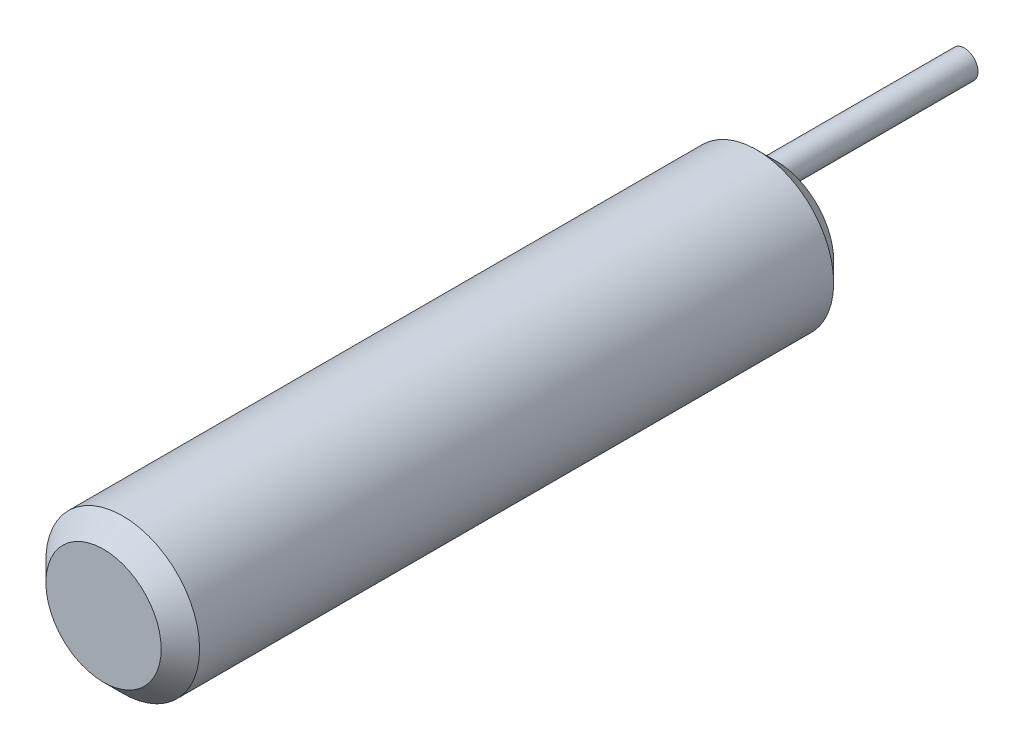
ISO-10303-21;
HEADER;
FILE_DESCRIPTION(('STEP AP214'),'2;1');
FILE_NAME('part.step','',(''),(''),'','','');
FILE_SCHEMA(('AUTOMOTIVE_DESIGN { 1 0 10303 214 1 1 1 1 }'));
ENDSEC;
DATA;
#1=APPLICATION_CONTEXT('core data for automotive mechanical design processes');
#2=APPLICATION_PROTOCOL_DEFINITION('international standard','automotive_design',2000,#1);
#3=PRODUCT_CONTEXT('',#1,'mechanical');
#4=PRODUCT('Part','Part','',(#3));
#5=PRODUCT_RELATED_PRODUCT_CATEGORY('part','',(#4));
#6=PRODUCT_DEFINITION_FORMATION('','',#4);
#7=PRODUCT_DEFINITION_CONTEXT('part definition',#1,'design');
#8=PRODUCT_DEFINITION('design','',#6,#7);
#9=PRODUCT_DEFINITION_SHAPE('','',#8);
#10=(LENGTH_UNIT() NAMED_UNIT(*) SI_UNIT(.MILLI.,.METRE.));
#11=(NAMED_UNIT(*) PLANE_ANGLE_UNIT() SI_UNIT($,.RADIAN.));
#12=(NAMED_UNIT(*) SI_UNIT($,.STERADIAN.) SOLID_ANGLE_UNIT());
#13=UNCERTAINTY_MEASURE_WITH_UNIT(LENGTH_MEASURE(1.E-05),#10,'distance_accuracy_value','');
#14=(GEOMETRIC_REPRESENTATION_CONTEXT(3) GLOBAL_UNCERTAINTY_ASSIGNED_CONTEXT((#13)) GLOBAL_UNIT_ASSIGNED_CONTEXT((#10,
#11,#12)) REPRESENTATION_CONTEXT('',''));
#15=CARTESIAN_POINT('',(0.,0.,0.));
#16=DIRECTION('',(0.,0.,1.));
#17=DIRECTION('',(1.,0.,0.));
#18=AXIS2_PLACEMENT_3D('',#15,#16,#17);
#19=CARTESIAN_POINT('',(0.,0.,0.));
#20=DIRECTION('',(0.,0.,1.));
#21=DIRECTION('',(1.,0.,0.));
#22=AXIS2_PLACEMENT_3D('',#19,#20,#21);
#23=PLANE('',#22);
#24=CARTESIAN_POINT('',(0.,0.,0.));
#25=DIRECTION('',(0.,0.,1.));
#26=DIRECTION('',(1.,0.,0.));
#27=AXIS2_PLACEMENT_3D('',#24,#25,#26);
#28=CIRCLE('',#27,3.);
#29=CARTESIAN_POINT('',(-0.262676540287967,2.98847804662881,0.));
#30=VERTEX_POINT('',#29);
#31=EDGE_CURVE('E41',#30,#30,#28,.F.);
#32=ORIENTED_EDGE('',*,*,#31,.T.);
#33=CARTESIAN_POINT('',(-0.200233264504433,2.27805922264817,0.));
#34=DIRECTION('',(0.,0.,-1.));
#35=DIRECTION('',(-1.,0.,0.));
#36=AXIS2_PLACEMENT_3D('',#33,#34,#35);
#37=CIRCLE('',#36,0.713157814341685);
#38=EDGE_CURVE('E57',#30,#30,#37,.T.);
#39=ORIENTED_EDGE('',*,*,#38,.F.);
#40=EDGE_LOOP('',(#32,#39));
#41=FACE_BOUND('',#40,.T.);
#42=ADVANCED_FACE('F34',(#41),#23,.F.);
#43=CARTESIAN_POINT('',(0.,0.,35.));
#44=DIRECTION('',(0.,0.,-1.));
#45=DIRECTION('',(-1.,0.,0.));
#46=AXIS2_PLACEMENT_3D('',#43,#44,#45);
#47=CYLINDRICAL_SURFACE('',#46,4.);
#48=CARTESIAN_POINT('',(0.,0.,1.));
#49=DIRECTION('',(0.,0.,1.));
#50=DIRECTION('',(1.,0.,0.));
#51=AXIS2_PLACEMENT_3D('',#48,#49,#50);
#52=CIRCLE('',#51,4.);
#53=CARTESIAN_POINT('',(4.,0.,1.));
#54=VERTEX_POINT('',#53);
#55=EDGE_CURVE('E49',#54,#54,#52,.T.);
#56=ORIENTED_EDGE('',*,*,#55,.T.);
#57=EDGE_LOOP('',(#56));
#58=FACE_BOUND('',#57,.T.);
#59=CARTESIAN_POINT('',(0.,0.,34.));
#60=DIRECTION('',(0.,0.,1.));
#61=DIRECTION('',(1.,0.,0.));
#62=AXIS2_PLACEMENT_3D('',#59,#60,#61);
#63=CIRCLE('',#62,4.);
#64=CARTESIAN_POINT('',(4.,0.,34.));
#65=VERTEX_POINT('',#64);
#66=EDGE_CURVE('E51',#65,#65,#63,.F.);
#67=ORIENTED_EDGE('',*,*,#66,.T.);
#68=EDGE_LOOP('',(#67));
#69=FACE_BOUND('',#68,.T.);
#70=ADVANCED_FACE('F70',(#58,#69),#47,.T.);
#71=CARTESIAN_POINT('',(0.,0.,35.));
#72=DIRECTION('',(0.,0.,1.));
#73=DIRECTION('',(1.,0.,0.));
#74=AXIS2_PLACEMENT_3D('',#71,#72,#73);
#75=PLANE('',#74);
#76=CARTESIAN_POINT('',(0.,0.,35.));
#77=DIRECTION('',(0.,0.,1.));
#78=DIRECTION('',(1.,0.,0.));
#79=AXIS2_PLACEMENT_3D('',#76,#77,#78);
#80=CIRCLE('',#79,2.99999999999999);
#81=CARTESIAN_POINT('',(2.99999999999999,0.,35.));
#82=VERTEX_POINT('',#81);
#83=EDGE_CURVE('E11',#82,#82,#80,.T.);
#84=ORIENTED_EDGE('',*,*,#83,.T.);
#85=EDGE_LOOP('',(#84));
#86=FACE_BOUND('',#85,.T.);
#87=ADVANCED_FACE('F75',(#86),#75,.T.);
#88=CARTESIAN_POINT('',(0.,0.,1.));
#89=DIRECTION('',(0.,0.,1.));
#90=DIRECTION('',(1.,0.,0.));
#91=AXIS2_PLACEMENT_3D('',#88,#89,#90);
#92=CONICAL_SURFACE('',#91,4.,0.785398163397448);
#93=ORIENTED_EDGE('',*,*,#31,.F.);
#94=EDGE_LOOP('',(#93));
#95=FACE_BOUND('',#94,.T.);
#96=ORIENTED_EDGE('',*,*,#55,.F.);
#97=EDGE_LOOP('',(#96));
#98=FACE_BOUND('',#97,.T.);
#99=ADVANCED_FACE('F45',(#95,#98),#92,.T.);
#100=CARTESIAN_POINT('',(0.,0.,35.));
#101=DIRECTION('',(0.,0.,-1.));
#102=DIRECTION('',(-1.,0.,0.));
#103=AXIS2_PLACEMENT_3D('',#100,#101,#102);
#104=CONICAL_SURFACE('',#103,2.99999999999999,0.785398163397448);
#105=ORIENTED_EDGE('',*,*,#66,.F.);
#106=EDGE_LOOP('',(#105));
#107=FACE_BOUND('',#106,.T.);
#108=ORIENTED_EDGE('',*,*,#83,.F.);
#109=EDGE_LOOP('',(#108));
#110=FACE_BOUND('',#109,.T.);
#111=ADVANCED_FACE('F36',(#107,#110),#104,.T.);
#112=CARTESIAN_POINT('',(-0.200233264504433,2.27805922264817,-10.));
#113=DIRECTION('',(0.,0.,1.));
#114=DIRECTION('',(1.,0.,0.));
#115=AXIS2_PLACEMENT_3D('',#112,#113,#114);
#116=CYLINDRICAL_SURFACE('',#115,0.713157814341685);
#117=CARTESIAN_POINT('',(-0.200233264504433,2.27805922264817,-10.));
#118=DIRECTION('',(0.,0.,-1.));
#119=DIRECTION('',(-1.,0.,0.));
#120=AXIS2_PLACEMENT_3D('',#117,#118,#119);
#121=CIRCLE('',#120,0.713157814341685);
#122=CARTESIAN_POINT('',(-0.913391078846118,2.27805922264817,-10.));
#123=VERTEX_POINT('',#122);
#124=EDGE_CURVE('E56',#123,#123,#121,.T.);
#125=ORIENTED_EDGE('',*,*,#124,.F.);
#126=EDGE_LOOP('',(#125));
#127=FACE_BOUND('',#126,.T.);
#128=ORIENTED_EDGE('',*,*,#38,.T.);
#129=EDGE_LOOP('',(#128));
#130=FACE_BOUND('',#129,.T.);
#131=ADVANCED_FACE('F65',(#127,#130),#116,.T.);
#132=CARTESIAN_POINT('',(-0.200233264504433,2.27805922264817,-10.));
#133=DIRECTION('',(0.,0.,-1.));
#134=DIRECTION('',(-1.,0.,0.));
#135=AXIS2_PLACEMENT_3D('',#132,#133,#134);
#136=PLANE('',#135);
#137=ORIENTED_EDGE('',*,*,#124,.T.);
#138=EDGE_LOOP('',(#137));
#139=FACE_BOUND('',#138,.T.);
#140=ADVANCED_FACE('F63',(#139),#136,.T.);
#141=CLOSED_SHELL('',(#42,#70,#87,#99,#111,#131,#140));
#142=MANIFOLD_SOLID_BREP('B2',#141);
#143=ADVANCED_BREP_SHAPE_REPRESENTATION('',(#18,#142),#14);
#144=SHAPE_DEFINITION_REPRESENTATION(#9,#143);
ENDSEC;
END-ISO-10303-21;
